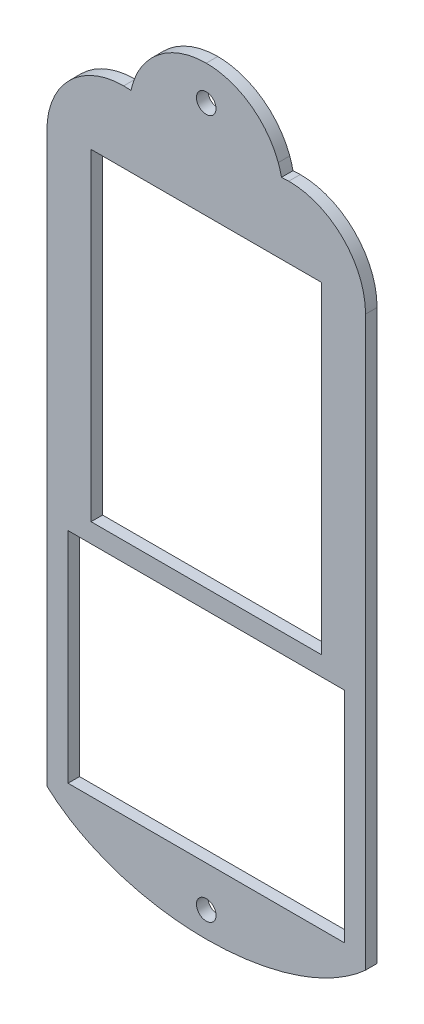
ISO-10303-21;
HEADER;
FILE_DESCRIPTION(('STEP AP214'),'2;1');
FILE_NAME('part.step','',(''),(''),'','','');
FILE_SCHEMA(('AUTOMOTIVE_DESIGN { 1 0 10303 214 1 1 1 1 }'));
ENDSEC;
DATA;
#1=APPLICATION_CONTEXT('core data for automotive mechanical design processes');
#2=APPLICATION_PROTOCOL_DEFINITION('international standard','automotive_design',2000,#1);
#3=PRODUCT_CONTEXT('',#1,'mechanical');
#4=PRODUCT('Part','Part','',(#3));
#5=PRODUCT_RELATED_PRODUCT_CATEGORY('part','',(#4));
#6=PRODUCT_DEFINITION_FORMATION('','',#4);
#7=PRODUCT_DEFINITION_CONTEXT('part definition',#1,'design');
#8=PRODUCT_DEFINITION('design','',#6,#7);
#9=PRODUCT_DEFINITION_SHAPE('','',#8);
#10=(LENGTH_UNIT() NAMED_UNIT(*) SI_UNIT(.MILLI.,.METRE.));
#11=(NAMED_UNIT(*) PLANE_ANGLE_UNIT() SI_UNIT($,.RADIAN.));
#12=(NAMED_UNIT(*) SI_UNIT($,.STERADIAN.) SOLID_ANGLE_UNIT());
#13=UNCERTAINTY_MEASURE_WITH_UNIT(LENGTH_MEASURE(1.E-05),#10,'distance_accuracy_value','');
#14=(GEOMETRIC_REPRESENTATION_CONTEXT(3) GLOBAL_UNCERTAINTY_ASSIGNED_CONTEXT((#13)) GLOBAL_UNIT_ASSIGNED_CONTEXT((#10,
#11,#12)) REPRESENTATION_CONTEXT('',''));
#15=CARTESIAN_POINT('',(0.,0.,0.));
#16=DIRECTION('',(0.,0.,1.));
#17=DIRECTION('',(1.,0.,0.));
#18=AXIS2_PLACEMENT_3D('',#15,#16,#17);
#19=CARTESIAN_POINT('',(-7.6058350285354,82.2924326123432,3.));
#20=DIRECTION('',(0.,0.,-1.));
#21=DIRECTION('',(-1.,0.,0.));
#22=AXIS2_PLACEMENT_3D('',#19,#20,#21);
#23=PLANE('',#22);
#24=DIRECTION('',(0.,-1.,0.));
#25=VECTOR('',#24,1.);
#26=CARTESIAN_POINT('',(-73.2491831836532,69.5718591249572,3.));
#27=LINE('',#26,#25);
#28=CARTESIAN_POINT('',(-73.2491831836532,69.5718591249572,3.));
#29=VERTEX_POINT('',#28);
#30=CARTESIAN_POINT('',(-73.2491831836531,-14.4281408750428,3.));
#31=VERTEX_POINT('',#30);
#32=EDGE_CURVE('E225',#29,#31,#27,.T.);
#33=ORIENTED_EDGE('',*,*,#32,.F.);
#34=DIRECTION('',(-1.,0.,0.));
#35=VECTOR('',#34,1.);
#36=CARTESIAN_POINT('',(-73.2491831836532,69.5718591249572,3.));
#37=LINE('',#36,#35);
#38=CARTESIAN_POINT('',(-13.2491831836531,69.5718591249572,3.));
#39=VERTEX_POINT('',#38);
#40=EDGE_CURVE('E233',#39,#29,#37,.T.);
#41=ORIENTED_EDGE('',*,*,#40,.F.);
#42=DIRECTION('',(0.,1.,0.));
#43=VECTOR('',#42,1.);
#44=CARTESIAN_POINT('',(-13.2491831836531,69.5718591249572,3.));
#45=LINE('',#44,#43);
#46=CARTESIAN_POINT('',(-13.2491831836531,-14.4281408750428,3.));
#47=VERTEX_POINT('',#46);
#48=EDGE_CURVE('E230',#47,#39,#45,.T.);
#49=ORIENTED_EDGE('',*,*,#48,.F.);
#50=DIRECTION('',(1.,0.,0.));
#51=VECTOR('',#50,1.);
#52=CARTESIAN_POINT('',(-73.2491831836531,-14.4281408750428,3.));
#53=LINE('',#52,#51);
#54=EDGE_CURVE('E227',#31,#47,#53,.T.);
#55=ORIENTED_EDGE('',*,*,#54,.F.);
#56=EDGE_LOOP('',(#33,#41,#49,#55));
#57=FACE_BOUND('',#56,.T.);
#58=CARTESIAN_POINT('',(-1.74840024860734,68.1508943137749,3.));
#59=CARTESIAN_POINT('',(-1.74840024860734,79.1963656719619,3.));
#60=CARTESIAN_POINT('',(-10.7019019689167,88.1498673922713,3.));
#61=CARTESIAN_POINT('',(-21.7473733271037,88.1498673922713,3.));
#62=B_SPLINE_CURVE_WITH_KNOTS('',3,(#58,#59,#60,#61),.UNSPECIFIED.,.F.,.F.,(4,4),(0.,1.),.UNSPECIFIED.);
#63=CARTESIAN_POINT('',(-1.74840024860734,68.1508943137749,3.));
#64=VERTEX_POINT('',#63);
#65=CARTESIAN_POINT('',(-21.7473733271037,88.1498673922713,3.));
#66=VERTEX_POINT('',#65);
#67=EDGE_CURVE('E267',#64,#66,#62,.T.);
#68=ORIENTED_EDGE('',*,*,#67,.T.);
#69=CARTESIAN_POINT('',(-21.7473733271037,88.1498673922713,3.));
#70=CARTESIAN_POINT('',(-22.3894314663204,88.1498673922713,3.));
#71=CARTESIAN_POINT('',(-23.0279583826646,88.1181294501134,3.));
#72=CARTESIAN_POINT('',(-23.6559131622385,88.0581417249765,3.));
#73=B_SPLINE_CURVE_WITH_KNOTS('',3,(#69,#70,#71,#72),.UNSPECIFIED.,.F.,.F.,(4,4),(1.,2.),.UNSPECIFIED.);
#74=CARTESIAN_POINT('',(-23.6559131622385,88.0581417249765,3.));
#75=VERTEX_POINT('',#74);
#76=EDGE_CURVE('E273',#66,#75,#73,.T.);
#77=ORIENTED_EDGE('',*,*,#76,.T.);
#78=CARTESIAN_POINT('',(-23.6559131622385,88.0581417249765,3.));
#79=CARTESIAN_POINT('',(-23.8605087703688,89.0565088647551,3.));
#80=CARTESIAN_POINT('',(-24.1427482179979,90.0301789762739,3.));
#81=CARTESIAN_POINT('',(-24.4884635499427,90.9720896137879,3.));
#82=B_SPLINE_CURVE_WITH_KNOTS('',3,(#78,#79,#80,#81),.UNSPECIFIED.,.F.,.F.,(4,4),(2.,3.),.UNSPECIFIED.);
#83=CARTESIAN_POINT('',(-24.4884635499427,90.9720896137879,3.));
#84=VERTEX_POINT('',#83);
#85=EDGE_CURVE('E282',#75,#84,#82,.T.);
#86=ORIENTED_EDGE('',*,*,#85,.T.);
#87=CARTESIAN_POINT('',(-24.4884635499427,90.9720896137879,3.));
#88=CARTESIAN_POINT('',(-27.3106857714594,98.592102530991,3.));
#89=CARTESIAN_POINT('',(-34.644928018161,104.024867388303,3.));
#90=CARTESIAN_POINT('',(-43.2491831836531,104.024867388303,3.));
#91=B_SPLINE_CURVE_WITH_KNOTS('',3,(#87,#88,#89,#90),.UNSPECIFIED.,.F.,.F.,(4,4),(3.,4.),.UNSPECIFIED.);
#92=CARTESIAN_POINT('',(-43.2491831836531,104.024867388303,3.));
#93=VERTEX_POINT('',#92);
#94=EDGE_CURVE('E305',#84,#93,#91,.T.);
#95=ORIENTED_EDGE('',*,*,#94,.T.);
#96=CARTESIAN_POINT('',(-43.2491831836531,104.024867388303,3.));
#97=CARTESIAN_POINT('',(-51.8534383491453,104.024867388303,3.));
#98=CARTESIAN_POINT('',(-59.1876805958469,98.592102530991,3.));
#99=CARTESIAN_POINT('',(-62.0099028173636,90.9720896137879,3.));
#100=B_SPLINE_CURVE_WITH_KNOTS('',3,(#96,#97,#98,#99),.UNSPECIFIED.,.F.,.F.,(4,4),(4.,5.),.UNSPECIFIED.);
#101=CARTESIAN_POINT('',(-62.0099028173636,90.9720896137879,3.));
#102=VERTEX_POINT('',#101);
#103=EDGE_CURVE('E309',#93,#102,#100,.T.);
#104=ORIENTED_EDGE('',*,*,#103,.T.);
#105=CARTESIAN_POINT('',(-62.0099028173636,90.9720896137879,3.));
#106=CARTESIAN_POINT('',(-62.3556396811552,90.0301789762739,3.));
#107=CARTESIAN_POINT('',(-62.6378575969375,89.0565088647551,3.));
#108=CARTESIAN_POINT('',(-62.8424532050678,88.0581417249765,3.));
#109=B_SPLINE_CURVE_WITH_KNOTS('',3,(#105,#106,#107,#108),.UNSPECIFIED.,.F.,.F.,(4,4),(5.,6.),.UNSPECIFIED.);
#110=CARTESIAN_POINT('',(-62.8424532050678,88.0581417249765,3.));
#111=VERTEX_POINT('',#110);
#112=EDGE_CURVE('E317',#102,#111,#109,.T.);
#113=ORIENTED_EDGE('',*,*,#112,.T.);
#114=CARTESIAN_POINT('',(-62.8424532050678,88.0581417249765,3.));
#115=CARTESIAN_POINT('',(-63.4704079846417,88.1181294501134,3.));
#116=CARTESIAN_POINT('',(-64.1054036781136,88.1498673922713,3.));
#117=CARTESIAN_POINT('',(-64.7474618173302,88.1498673922713,3.));
#118=B_SPLINE_CURVE_WITH_KNOTS('',3,(#114,#115,#116,#117),.UNSPECIFIED.,.F.,.F.,(4,4),(6.,7.),.UNSPECIFIED.);
#119=CARTESIAN_POINT('',(-64.7474618173302,88.1498673922713,3.));
#120=VERTEX_POINT('',#119);
#121=EDGE_CURVE('E325',#111,#120,#118,.T.);
#122=ORIENTED_EDGE('',*,*,#121,.T.);
#123=CARTESIAN_POINT('',(-64.7474618173302,88.1498673922713,3.));
#124=CARTESIAN_POINT('',(-75.7964643983896,88.1498673922713,3.));
#125=CARTESIAN_POINT('',(-84.749966118699,79.1963656719619,3.));
#126=CARTESIAN_POINT('',(-84.749966118699,68.1508943137749,3.));
#127=B_SPLINE_CURVE_WITH_KNOTS('',3,(#123,#124,#125,#126),.UNSPECIFIED.,.F.,.F.,(4,4),(7.,8.),.UNSPECIFIED.);
#128=CARTESIAN_POINT('',(-84.749966118699,68.1508943137749,3.));
#129=VERTEX_POINT('',#128);
#130=EDGE_CURVE('E347',#120,#129,#127,.T.);
#131=ORIENTED_EDGE('',*,*,#130,.T.);
#132=DIRECTION('',(0.,-1.,0.));
#133=VECTOR('',#132,1.);
#134=CARTESIAN_POINT('',(-84.749966118699,68.1508943137749,3.));
#135=LINE('',#134,#133);
#136=CARTESIAN_POINT('',(-84.7499661186989,-79.8491056862251,3.));
#137=VERTEX_POINT('',#136);
#138=EDGE_CURVE('E352',#129,#137,#135,.T.);
#139=ORIENTED_EDGE('',*,*,#138,.T.);
#140=CARTESIAN_POINT('',(-84.7499661186989,-79.8491056862251,3.));
#141=CARTESIAN_POINT('',(-81.6384635356552,-82.6924937131293,3.));
#142=CARTESIAN_POINT('',(-77.8178741743599,-85.1972288538334,3.));
#143=CARTESIAN_POINT('',(-73.4469523411428,-87.2680326863235,3.));
#144=B_SPLINE_CURVE_WITH_KNOTS('',3,(#140,#141,#142,#143),.UNSPECIFIED.,.F.,.F.,(4,4),(11.,12.),.UNSPECIFIED.);
#145=CARTESIAN_POINT('',(-73.4469523411428,-87.2680326863235,3.));
#146=VERTEX_POINT('',#145);
#147=EDGE_CURVE('E357',#137,#146,#144,.T.);
#148=ORIENTED_EDGE('',*,*,#147,.T.);
#149=CARTESIAN_POINT('',(-73.4469523411428,-87.2680326863235,3.));
#150=CARTESIAN_POINT('',(-65.0296797331125,-91.2579484907188,3.));
#151=CARTESIAN_POINT('',(-54.5733412347501,-93.618032684736,3.));
#152=CARTESIAN_POINT('',(-43.2491831836531,-93.618032684736,3.));
#153=B_SPLINE_CURVE_WITH_KNOTS('',3,(#149,#150,#151,#152),.UNSPECIFIED.,.F.,.F.,(4,4),(12.,13.),.UNSPECIFIED.);
#154=CARTESIAN_POINT('',(-43.2491831836531,-93.618032684736,3.));
#155=VERTEX_POINT('',#154);
#156=EDGE_CURVE('E362',#146,#155,#153,.T.);
#157=ORIENTED_EDGE('',*,*,#156,.T.);
#158=CARTESIAN_POINT('',(-43.2491831836531,-93.618032684736,3.));
#159=CARTESIAN_POINT('',(-31.9250251325562,-93.618032684736,3.));
#160=CARTESIAN_POINT('',(-21.4686866341937,-91.2579484907188,3.));
#161=CARTESIAN_POINT('',(-13.0514140261635,-87.2680326863235,3.));
#162=B_SPLINE_CURVE_WITH_KNOTS('',3,(#158,#159,#160,#161),.UNSPECIFIED.,.F.,.F.,(4,4),(13.,14.),.UNSPECIFIED.);
#163=CARTESIAN_POINT('',(-13.0514140261635,-87.2680326863235,3.));
#164=VERTEX_POINT('',#163);
#165=EDGE_CURVE('E385',#155,#164,#162,.T.);
#166=ORIENTED_EDGE('',*,*,#165,.T.);
#167=CARTESIAN_POINT('',(-13.0514140261635,-87.2680326863235,3.));
#168=CARTESIAN_POINT('',(-8.68049219294634,-85.1972288538334,3.));
#169=CARTESIAN_POINT('',(-4.85990283165106,-82.6924937131293,3.));
#170=CARTESIAN_POINT('',(-1.74840024860732,-79.8491056862251,3.));
#171=B_SPLINE_CURVE_WITH_KNOTS('',3,(#167,#168,#169,#170),.UNSPECIFIED.,.F.,.F.,(4,4),(14.,15.),.UNSPECIFIED.);
#172=CARTESIAN_POINT('',(-1.74840024860732,-79.8491056862251,3.));
#173=VERTEX_POINT('',#172);
#174=EDGE_CURVE('E389',#164,#173,#171,.T.);
#175=ORIENTED_EDGE('',*,*,#174,.T.);
#176=DIRECTION('',(0.,1.,0.));
#177=VECTOR('',#176,1.);
#178=CARTESIAN_POINT('',(-1.74840024860734,68.1508943137749,3.));
#179=LINE('',#178,#177);
#180=EDGE_CURVE('E397',#173,#64,#179,.T.);
#181=ORIENTED_EDGE('',*,*,#180,.T.);
#182=EDGE_LOOP('',(#68,#77,#86,#95,#104,#113,#122,#131,#139,#148,#157,#166,#175,#181));
#183=FACE_BOUND('',#182,.T.);
#184=CARTESIAN_POINT('',(-43.2491831836531,95.0101030947806,3.));
#185=DIRECTION('',(0.,0.,1.));
#186=DIRECTION('',(1.,0.,0.));
#187=AXIS2_PLACEMENT_3D('',#184,#185,#186);
#188=CIRCLE('',#187,2.55);
#189=CARTESIAN_POINT('',(-40.6991831836531,95.0101030947806,3.));
#190=VERTEX_POINT('',#189);
#191=EDGE_CURVE('E262',#190,#190,#188,.T.);
#192=ORIENTED_EDGE('',*,*,#191,.F.);
#193=EDGE_LOOP('',(#192));
#194=FACE_BOUND('',#193,.T.);
#195=CARTESIAN_POINT('',(-43.2491831836531,-86.9898969052195,3.));
#196=DIRECTION('',(0.,0.,1.));
#197=DIRECTION('',(1.,0.,0.));
#198=AXIS2_PLACEMENT_3D('',#195,#196,#197);
#199=CIRCLE('',#198,2.54999999999999);
#200=CARTESIAN_POINT('',(-40.6991831836532,-86.9898969052195,3.));
#201=VERTEX_POINT('',#200);
#202=EDGE_CURVE('E256',#201,#201,#199,.T.);
#203=ORIENTED_EDGE('',*,*,#202,.F.);
#204=EDGE_LOOP('',(#203));
#205=FACE_BOUND('',#204,.T.);
#206=DIRECTION('',(0.,-1.,0.));
#207=VECTOR('',#206,1.);
#208=CARTESIAN_POINT('',(-79.2491831836531,-19.4281408750428,3.));
#209=LINE('',#208,#207);
#210=CARTESIAN_POINT('',(-79.2491831836531,-19.4281408750428,3.));
#211=VERTEX_POINT('',#210);
#212=CARTESIAN_POINT('',(-79.2491831836531,-76.4281408750428,3.));
#213=VERTEX_POINT('',#212);
#214=EDGE_CURVE('E189',#211,#213,#209,.T.);
#215=ORIENTED_EDGE('',*,*,#214,.F.);
#216=DIRECTION('',(-1.,0.,0.));
#217=VECTOR('',#216,1.);
#218=CARTESIAN_POINT('',(-79.2491831836531,-19.4281408750428,3.));
#219=LINE('',#218,#217);
#220=CARTESIAN_POINT('',(-7.24918318365313,-19.4281408750428,3.));
#221=VERTEX_POINT('',#220);
#222=EDGE_CURVE('E211',#221,#211,#219,.T.);
#223=ORIENTED_EDGE('',*,*,#222,.F.);
#224=DIRECTION('',(0.,1.,0.));
#225=VECTOR('',#224,1.);
#226=CARTESIAN_POINT('',(-7.24918318365313,-19.4281408750428,3.));
#227=LINE('',#226,#225);
#228=CARTESIAN_POINT('',(-7.24918318365311,-76.4281408750428,3.));
#229=VERTEX_POINT('',#228);
#230=EDGE_CURVE('E209',#229,#221,#227,.T.);
#231=ORIENTED_EDGE('',*,*,#230,.F.);
#232=DIRECTION('',(1.,0.,0.));
#233=VECTOR('',#232,1.);
#234=CARTESIAN_POINT('',(-79.2491831836531,-76.4281408750428,3.));
#235=LINE('',#234,#233);
#236=EDGE_CURVE('E197',#213,#229,#235,.T.);
#237=ORIENTED_EDGE('',*,*,#236,.F.);
#238=EDGE_LOOP('',(#215,#223,#231,#237));
#239=FACE_BOUND('',#238,.T.);
#240=ADVANCED_FACE('F39',(#57,#183,#194,#205,#239),#23,.F.);
#241=CARTESIAN_POINT('',(-7.6058350285354,82.2924326123432,0.));
#242=DIRECTION('',(0.,0.,-1.));
#243=DIRECTION('',(-1.,0.,0.));
#244=AXIS2_PLACEMENT_3D('',#241,#242,#243);
#245=PLANE('',#244);
#246=CARTESIAN_POINT('',(-43.2491831836531,95.0101030947806,0.));
#247=DIRECTION('',(0.,0.,1.));
#248=DIRECTION('',(1.,0.,0.));
#249=AXIS2_PLACEMENT_3D('',#246,#247,#248);
#250=CIRCLE('',#249,2.55);
#251=CARTESIAN_POINT('',(-40.6991831836531,95.0101030947806,0.));
#252=VERTEX_POINT('',#251);
#253=EDGE_CURVE('E259',#252,#252,#250,.T.);
#254=ORIENTED_EDGE('',*,*,#253,.T.);
#255=EDGE_LOOP('',(#254));
#256=FACE_BOUND('',#255,.T.);
#257=CARTESIAN_POINT('',(-1.74840024860734,68.1508943137749,0.));
#258=CARTESIAN_POINT('',(-1.74840024860734,79.1963656719619,0.));
#259=CARTESIAN_POINT('',(-10.7019019689167,88.1498673922713,0.));
#260=CARTESIAN_POINT('',(-21.7473733271037,88.1498673922713,0.));
#261=B_SPLINE_CURVE_WITH_KNOTS('',3,(#257,#258,#259,#260),.UNSPECIFIED.,.F.,.F.,(4,4),(0.,1.),.UNSPECIFIED.);
#262=CARTESIAN_POINT('',(-1.74840024860734,68.1508943137749,0.));
#263=VERTEX_POINT('',#262);
#264=CARTESIAN_POINT('',(-21.7473733271037,88.1498673922713,0.));
#265=VERTEX_POINT('',#264);
#266=EDGE_CURVE('E265',#263,#265,#261,.T.);
#267=ORIENTED_EDGE('',*,*,#266,.F.);
#268=DIRECTION('',(0.,1.,0.));
#269=VECTOR('',#268,1.);
#270=CARTESIAN_POINT('',(-1.74840024860734,68.1508943137749,0.));
#271=LINE('',#270,#269);
#272=CARTESIAN_POINT('',(-1.74840024860732,-79.8491056862251,0.));
#273=VERTEX_POINT('',#272);
#274=EDGE_CURVE('E274',#273,#263,#271,.T.);
#275=ORIENTED_EDGE('',*,*,#274,.F.);
#276=CARTESIAN_POINT('',(-13.0514140261635,-87.2680326863235,0.));
#277=CARTESIAN_POINT('',(-8.68049219294634,-85.1972288538334,0.));
#278=CARTESIAN_POINT('',(-4.85990283165106,-82.6924937131293,0.));
#279=CARTESIAN_POINT('',(-1.74840024860732,-79.8491056862251,0.));
#280=B_SPLINE_CURVE_WITH_KNOTS('',3,(#276,#277,#278,#279),.UNSPECIFIED.,.F.,.F.,(4,4),(14.,15.),.UNSPECIFIED.);
#281=CARTESIAN_POINT('',(-13.0514140261635,-87.2680326863235,0.));
#282=VERTEX_POINT('',#281);
#283=EDGE_CURVE('E479',#282,#273,#280,.T.);
#284=ORIENTED_EDGE('',*,*,#283,.F.);
#285=CARTESIAN_POINT('',(-43.2491831836531,-93.618032684736,0.));
#286=CARTESIAN_POINT('',(-31.9250251325562,-93.618032684736,0.));
#287=CARTESIAN_POINT('',(-21.4686866341937,-91.2579484907188,0.));
#288=CARTESIAN_POINT('',(-13.0514140261635,-87.2680326863235,0.));
#289=B_SPLINE_CURVE_WITH_KNOTS('',3,(#285,#286,#287,#288),.UNSPECIFIED.,.F.,.F.,(4,4),(13.,14.),.UNSPECIFIED.);
#290=CARTESIAN_POINT('',(-43.2491831836531,-93.618032684736,0.));
#291=VERTEX_POINT('',#290);
#292=EDGE_CURVE('E472',#291,#282,#289,.T.);
#293=ORIENTED_EDGE('',*,*,#292,.F.);
#294=CARTESIAN_POINT('',(-73.4469523411428,-87.2680326863235,0.));
#295=CARTESIAN_POINT('',(-65.0296797331125,-91.2579484907188,0.));
#296=CARTESIAN_POINT('',(-54.5733412347501,-93.618032684736,0.));
#297=CARTESIAN_POINT('',(-43.2491831836531,-93.618032684736,0.));
#298=B_SPLINE_CURVE_WITH_KNOTS('',3,(#294,#295,#296,#297),.UNSPECIFIED.,.F.,.F.,(4,4),(12.,13.),.UNSPECIFIED.);
#299=CARTESIAN_POINT('',(-73.4469523411428,-87.2680326863235,0.));
#300=VERTEX_POINT('',#299);
#301=EDGE_CURVE('E465',#300,#291,#298,.T.);
#302=ORIENTED_EDGE('',*,*,#301,.F.);
#303=CARTESIAN_POINT('',(-84.7499661186989,-79.8491056862251,0.));
#304=CARTESIAN_POINT('',(-81.6384635356552,-82.6924937131293,0.));
#305=CARTESIAN_POINT('',(-77.8178741743599,-85.1972288538334,0.));
#306=CARTESIAN_POINT('',(-73.4469523411428,-87.2680326863235,0.));
#307=B_SPLINE_CURVE_WITH_KNOTS('',3,(#303,#304,#305,#306),.UNSPECIFIED.,.F.,.F.,(4,4),(11.,12.),.UNSPECIFIED.);
#308=CARTESIAN_POINT('',(-84.7499661186989,-79.8491056862251,0.));
#309=VERTEX_POINT('',#308);
#310=EDGE_CURVE('E461',#309,#300,#307,.T.);
#311=ORIENTED_EDGE('',*,*,#310,.F.);
#312=DIRECTION('',(0.,-1.,0.));
#313=VECTOR('',#312,1.);
#314=CARTESIAN_POINT('',(-84.749966118699,68.1508943137749,0.));
#315=LINE('',#314,#313);
#316=CARTESIAN_POINT('',(-84.749966118699,68.1508943137749,0.));
#317=VERTEX_POINT('',#316);
#318=EDGE_CURVE('E456',#317,#309,#315,.T.);
#319=ORIENTED_EDGE('',*,*,#318,.F.);
#320=CARTESIAN_POINT('',(-64.7474618173302,88.1498673922713,0.));
#321=CARTESIAN_POINT('',(-75.7964643983896,88.1498673922713,0.));
#322=CARTESIAN_POINT('',(-84.749966118699,79.1963656719619,0.));
#323=CARTESIAN_POINT('',(-84.749966118699,68.1508943137749,0.));
#324=B_SPLINE_CURVE_WITH_KNOTS('',3,(#320,#321,#322,#323),.UNSPECIFIED.,.F.,.F.,(4,4),(7.,8.),.UNSPECIFIED.);
#325=CARTESIAN_POINT('',(-64.7474618173302,88.1498673922713,0.));
#326=VERTEX_POINT('',#325);
#327=EDGE_CURVE('E449',#326,#317,#324,.T.);
#328=ORIENTED_EDGE('',*,*,#327,.F.);
#329=CARTESIAN_POINT('',(-62.8424532050678,88.0581417249765,0.));
#330=CARTESIAN_POINT('',(-63.4704079846417,88.1181294501134,0.));
#331=CARTESIAN_POINT('',(-64.1054036781136,88.1498673922713,0.));
#332=CARTESIAN_POINT('',(-64.7474618173302,88.1498673922713,0.));
#333=B_SPLINE_CURVE_WITH_KNOTS('',3,(#329,#330,#331,#332),.UNSPECIFIED.,.F.,.F.,(4,4),(6.,7.),.UNSPECIFIED.);
#334=CARTESIAN_POINT('',(-62.8424532050678,88.0581417249765,0.));
#335=VERTEX_POINT('',#334);
#336=EDGE_CURVE('E442',#335,#326,#333,.T.);
#337=ORIENTED_EDGE('',*,*,#336,.F.);
#338=CARTESIAN_POINT('',(-62.0099028173636,90.9720896137879,0.));
#339=CARTESIAN_POINT('',(-62.3556396811552,90.0301789762739,0.));
#340=CARTESIAN_POINT('',(-62.6378575969375,89.0565088647551,0.));
#341=CARTESIAN_POINT('',(-62.8424532050678,88.0581417249765,0.));
#342=B_SPLINE_CURVE_WITH_KNOTS('',3,(#338,#339,#340,#341),.UNSPECIFIED.,.F.,.F.,(4,4),(5.,6.),.UNSPECIFIED.);
#343=CARTESIAN_POINT('',(-62.0099028173636,90.9720896137879,0.));
#344=VERTEX_POINT('',#343);
#345=EDGE_CURVE('E435',#344,#335,#342,.T.);
#346=ORIENTED_EDGE('',*,*,#345,.F.);
#347=CARTESIAN_POINT('',(-43.2491831836531,104.024867388303,0.));
#348=CARTESIAN_POINT('',(-51.8534383491453,104.024867388303,0.));
#349=CARTESIAN_POINT('',(-59.1876805958469,98.592102530991,0.));
#350=CARTESIAN_POINT('',(-62.0099028173636,90.9720896137879,0.));
#351=B_SPLINE_CURVE_WITH_KNOTS('',3,(#347,#348,#349,#350),.UNSPECIFIED.,.F.,.F.,(4,4),(4.,5.),.UNSPECIFIED.);
#352=CARTESIAN_POINT('',(-43.2491831836531,104.024867388303,0.));
#353=VERTEX_POINT('',#352);
#354=EDGE_CURVE('E428',#353,#344,#351,.T.);
#355=ORIENTED_EDGE('',*,*,#354,.F.);
#356=CARTESIAN_POINT('',(-24.4884635499427,90.9720896137879,0.));
#357=CARTESIAN_POINT('',(-27.3106857714594,98.592102530991,0.));
#358=CARTESIAN_POINT('',(-34.644928018161,104.024867388303,0.));
#359=CARTESIAN_POINT('',(-43.2491831836531,104.024867388303,0.));
#360=B_SPLINE_CURVE_WITH_KNOTS('',3,(#356,#357,#358,#359),.UNSPECIFIED.,.F.,.F.,(4,4),(3.,4.),.UNSPECIFIED.);
#361=CARTESIAN_POINT('',(-24.4884635499427,90.9720896137879,0.));
#362=VERTEX_POINT('',#361);
#363=EDGE_CURVE('E421',#362,#353,#360,.T.);
#364=ORIENTED_EDGE('',*,*,#363,.F.);
#365=CARTESIAN_POINT('',(-23.6559131622385,88.0581417249765,0.));
#366=CARTESIAN_POINT('',(-23.8605087703688,89.0565088647551,0.));
#367=CARTESIAN_POINT('',(-24.1427482179979,90.0301789762739,0.));
#368=CARTESIAN_POINT('',(-24.4884635499427,90.9720896137879,0.));
#369=B_SPLINE_CURVE_WITH_KNOTS('',3,(#365,#366,#367,#368),.UNSPECIFIED.,.F.,.F.,(4,4),(2.,3.),.UNSPECIFIED.);
#370=CARTESIAN_POINT('',(-23.6559131622385,88.0581417249765,0.));
#371=VERTEX_POINT('',#370);
#372=EDGE_CURVE('E414',#371,#362,#369,.T.);
#373=ORIENTED_EDGE('',*,*,#372,.F.);
#374=CARTESIAN_POINT('',(-21.7473733271037,88.1498673922713,0.));
#375=CARTESIAN_POINT('',(-22.3894314663204,88.1498673922713,0.));
#376=CARTESIAN_POINT('',(-23.0279583826646,88.1181294501134,0.));
#377=CARTESIAN_POINT('',(-23.6559131622385,88.0581417249765,0.));
#378=B_SPLINE_CURVE_WITH_KNOTS('',3,(#374,#375,#376,#377),.UNSPECIFIED.,.F.,.F.,(4,4),(1.,2.),.UNSPECIFIED.);
#379=EDGE_CURVE('E407',#265,#371,#378,.T.);
#380=ORIENTED_EDGE('',*,*,#379,.F.);
#381=EDGE_LOOP('',(#267,#275,#284,#293,#302,#311,#319,#328,#337,#346,#355,#364,#373,#380));
#382=FACE_BOUND('',#381,.T.);
#383=CARTESIAN_POINT('',(-43.2491831836531,-86.9898969052195,0.));
#384=DIRECTION('',(0.,0.,1.));
#385=DIRECTION('',(1.,0.,0.));
#386=AXIS2_PLACEMENT_3D('',#383,#384,#385);
#387=CIRCLE('',#386,2.54999999999999);
#388=CARTESIAN_POINT('',(-40.6991831836532,-86.9898969052195,0.));
#389=VERTEX_POINT('',#388);
#390=EDGE_CURVE('E255',#389,#389,#387,.T.);
#391=ORIENTED_EDGE('',*,*,#390,.T.);
#392=EDGE_LOOP('',(#391));
#393=FACE_BOUND('',#392,.T.);
#394=DIRECTION('',(-1.,0.,0.));
#395=VECTOR('',#394,1.);
#396=CARTESIAN_POINT('',(-73.2491831836532,69.5718591249572,0.));
#397=LINE('',#396,#395);
#398=CARTESIAN_POINT('',(-13.2491831836531,69.5718591249572,0.));
#399=VERTEX_POINT('',#398);
#400=CARTESIAN_POINT('',(-73.2491831836532,69.5718591249572,0.));
#401=VERTEX_POINT('',#400);
#402=EDGE_CURVE('E228',#399,#401,#397,.T.);
#403=ORIENTED_EDGE('',*,*,#402,.T.);
#404=DIRECTION('',(0.,-1.,0.));
#405=VECTOR('',#404,1.);
#406=CARTESIAN_POINT('',(-73.2491831836532,69.5718591249572,0.));
#407=LINE('',#406,#405);
#408=CARTESIAN_POINT('',(-73.2491831836531,-14.4281408750428,0.));
#409=VERTEX_POINT('',#408);
#410=EDGE_CURVE('E205',#401,#409,#407,.T.);
#411=ORIENTED_EDGE('',*,*,#410,.T.);
#412=DIRECTION('',(1.,0.,0.));
#413=VECTOR('',#412,1.);
#414=CARTESIAN_POINT('',(-73.2491831836531,-14.4281408750428,0.));
#415=LINE('',#414,#413);
#416=CARTESIAN_POINT('',(-13.2491831836531,-14.4281408750428,0.));
#417=VERTEX_POINT('',#416);
#418=EDGE_CURVE('E238',#409,#417,#415,.T.);
#419=ORIENTED_EDGE('',*,*,#418,.T.);
#420=DIRECTION('',(0.,1.,0.));
#421=VECTOR('',#420,1.);
#422=CARTESIAN_POINT('',(-13.2491831836531,69.5718591249572,0.));
#423=LINE('',#422,#421);
#424=EDGE_CURVE('E241',#417,#399,#423,.T.);
#425=ORIENTED_EDGE('',*,*,#424,.T.);
#426=EDGE_LOOP('',(#403,#411,#419,#425));
#427=FACE_BOUND('',#426,.T.);
#428=DIRECTION('',(-1.,0.,0.));
#429=VECTOR('',#428,1.);
#430=CARTESIAN_POINT('',(-79.2491831836531,-19.4281408750428,0.));
#431=LINE('',#430,#429);
#432=CARTESIAN_POINT('',(-7.24918318365313,-19.4281408750428,0.));
#433=VERTEX_POINT('',#432);
#434=CARTESIAN_POINT('',(-79.2491831836531,-19.4281408750428,0.));
#435=VERTEX_POINT('',#434);
#436=EDGE_CURVE('E198',#433,#435,#431,.T.);
#437=ORIENTED_EDGE('',*,*,#436,.T.);
#438=DIRECTION('',(0.,-1.,0.));
#439=VECTOR('',#438,1.);
#440=CARTESIAN_POINT('',(-79.2491831836531,-19.4281408750428,0.));
#441=LINE('',#440,#439);
#442=CARTESIAN_POINT('',(-79.2491831836531,-76.4281408750428,0.));
#443=VERTEX_POINT('',#442);
#444=EDGE_CURVE('E63',#435,#443,#441,.T.);
#445=ORIENTED_EDGE('',*,*,#444,.T.);
#446=DIRECTION('',(1.,0.,0.));
#447=VECTOR('',#446,1.);
#448=CARTESIAN_POINT('',(-79.2491831836531,-76.4281408750428,0.));
#449=LINE('',#448,#447);
#450=CARTESIAN_POINT('',(-7.24918318365311,-76.4281408750428,0.));
#451=VERTEX_POINT('',#450);
#452=EDGE_CURVE('E204',#443,#451,#449,.T.);
#453=ORIENTED_EDGE('',*,*,#452,.T.);
#454=DIRECTION('',(0.,1.,0.));
#455=VECTOR('',#454,1.);
#456=CARTESIAN_POINT('',(-7.24918318365313,-19.4281408750428,0.));
#457=LINE('',#456,#455);
#458=EDGE_CURVE('E217',#451,#433,#457,.T.);
#459=ORIENTED_EDGE('',*,*,#458,.T.);
#460=EDGE_LOOP('',(#437,#445,#453,#459));
#461=FACE_BOUND('',#460,.T.);
#462=ADVANCED_FACE('F532',(#256,#382,#393,#427,#461),#245,.T.);
#463=DIRECTION('',(0.,0.,-1.));
#464=VECTOR('',#463,1.);
#465=SURFACE_OF_LINEAR_EXTRUSION('',#62,#464);
#466=ORIENTED_EDGE('',*,*,#266,.T.);
#467=DIRECTION('',(0.,0.,-1.));
#468=VECTOR('',#467,1.);
#469=CARTESIAN_POINT('',(-21.7473733271037,88.1498673922713,3.));
#470=LINE('',#469,#468);
#471=EDGE_CURVE('E11',#66,#265,#470,.T.);
#472=ORIENTED_EDGE('',*,*,#471,.F.);
#473=ORIENTED_EDGE('',*,*,#67,.F.);
#474=DIRECTION('',(0.,0.,-1.));
#475=VECTOR('',#474,1.);
#476=CARTESIAN_POINT('',(-1.74840024860734,68.1508943137749,3.));
#477=LINE('',#476,#475);
#478=EDGE_CURVE('E402',#64,#263,#477,.T.);
#479=ORIENTED_EDGE('',*,*,#478,.T.);
#480=EDGE_LOOP('',(#466,#472,#473,#479));
#481=FACE_BOUND('',#480,.T.);
#482=ADVANCED_FACE('F41',(#481),#465,.F.);
#483=DIRECTION('',(0.,0.,-1.));
#484=VECTOR('',#483,1.);
#485=SURFACE_OF_LINEAR_EXTRUSION('',#73,#484);
#486=ORIENTED_EDGE('',*,*,#379,.T.);
#487=DIRECTION('',(0.,0.,-1.));
#488=VECTOR('',#487,1.);
#489=CARTESIAN_POINT('',(-23.6559131622385,88.0581417249765,3.));
#490=LINE('',#489,#488);
#491=EDGE_CURVE('E48',#75,#371,#490,.T.);
#492=ORIENTED_EDGE('',*,*,#491,.F.);
#493=ORIENTED_EDGE('',*,*,#76,.F.);
#494=ORIENTED_EDGE('',*,*,#471,.T.);
#495=EDGE_LOOP('',(#486,#492,#493,#494));
#496=FACE_BOUND('',#495,.T.);
#497=ADVANCED_FACE('F290',(#496),#485,.F.);
#498=DIRECTION('',(0.,0.,-1.));
#499=VECTOR('',#498,1.);
#500=SURFACE_OF_LINEAR_EXTRUSION('',#82,#499);
#501=ORIENTED_EDGE('',*,*,#372,.T.);
#502=DIRECTION('',(0.,0.,-1.));
#503=VECTOR('',#502,1.);
#504=CARTESIAN_POINT('',(-24.4884635499427,90.9720896137879,3.));
#505=LINE('',#504,#503);
#506=EDGE_CURVE('E522',#84,#362,#505,.T.);
#507=ORIENTED_EDGE('',*,*,#506,.F.);
#508=ORIENTED_EDGE('',*,*,#85,.F.);
#509=ORIENTED_EDGE('',*,*,#491,.T.);
#510=EDGE_LOOP('',(#501,#507,#508,#509));
#511=FACE_BOUND('',#510,.T.);
#512=ADVANCED_FACE('F293',(#511),#500,.F.);
#513=DIRECTION('',(0.,0.,-1.));
#514=VECTOR('',#513,1.);
#515=SURFACE_OF_LINEAR_EXTRUSION('',#91,#514);
#516=ORIENTED_EDGE('',*,*,#363,.T.);
#517=DIRECTION('',(0.,0.,-1.));
#518=VECTOR('',#517,1.);
#519=CARTESIAN_POINT('',(-43.2491831836531,104.024867388303,3.));
#520=LINE('',#519,#518);
#521=EDGE_CURVE('E519',#93,#353,#520,.T.);
#522=ORIENTED_EDGE('',*,*,#521,.F.);
#523=ORIENTED_EDGE('',*,*,#94,.F.);
#524=ORIENTED_EDGE('',*,*,#506,.T.);
#525=EDGE_LOOP('',(#516,#522,#523,#524));
#526=FACE_BOUND('',#525,.T.);
#527=ADVANCED_FACE('F297',(#526),#515,.F.);
#528=DIRECTION('',(0.,0.,-1.));
#529=VECTOR('',#528,1.);
#530=SURFACE_OF_LINEAR_EXTRUSION('',#100,#529);
#531=ORIENTED_EDGE('',*,*,#354,.T.);
#532=DIRECTION('',(0.,0.,-1.));
#533=VECTOR('',#532,1.);
#534=CARTESIAN_POINT('',(-62.0099028173636,90.9720896137879,3.));
#535=LINE('',#534,#533);
#536=EDGE_CURVE('E516',#102,#344,#535,.T.);
#537=ORIENTED_EDGE('',*,*,#536,.F.);
#538=ORIENTED_EDGE('',*,*,#103,.F.);
#539=ORIENTED_EDGE('',*,*,#521,.T.);
#540=EDGE_LOOP('',(#531,#537,#538,#539));
#541=FACE_BOUND('',#540,.T.);
#542=ADVANCED_FACE('F301',(#541),#530,.F.);
#543=DIRECTION('',(0.,0.,-1.));
#544=VECTOR('',#543,1.);
#545=SURFACE_OF_LINEAR_EXTRUSION('',#109,#544);
#546=ORIENTED_EDGE('',*,*,#345,.T.);
#547=DIRECTION('',(0.,0.,-1.));
#548=VECTOR('',#547,1.);
#549=CARTESIAN_POINT('',(-62.8424532050678,88.0581417249765,3.));
#550=LINE('',#549,#548);
#551=EDGE_CURVE('E513',#111,#335,#550,.T.);
#552=ORIENTED_EDGE('',*,*,#551,.F.);
#553=ORIENTED_EDGE('',*,*,#112,.F.);
#554=ORIENTED_EDGE('',*,*,#536,.T.);
#555=EDGE_LOOP('',(#546,#552,#553,#554));
#556=FACE_BOUND('',#555,.T.);
#557=ADVANCED_FACE('F333',(#556),#545,.F.);
#558=DIRECTION('',(0.,0.,-1.));
#559=VECTOR('',#558,1.);
#560=SURFACE_OF_LINEAR_EXTRUSION('',#118,#559);
#561=ORIENTED_EDGE('',*,*,#336,.T.);
#562=DIRECTION('',(0.,0.,-1.));
#563=VECTOR('',#562,1.);
#564=CARTESIAN_POINT('',(-64.7474618173302,88.1498673922713,3.));
#565=LINE('',#564,#563);
#566=EDGE_CURVE('E510',#120,#326,#565,.T.);
#567=ORIENTED_EDGE('',*,*,#566,.F.);
#568=ORIENTED_EDGE('',*,*,#121,.F.);
#569=ORIENTED_EDGE('',*,*,#551,.T.);
#570=EDGE_LOOP('',(#561,#567,#568,#569));
#571=FACE_BOUND('',#570,.T.);
#572=ADVANCED_FACE('F336',(#571),#560,.F.);
#573=DIRECTION('',(0.,0.,-1.));
#574=VECTOR('',#573,1.);
#575=SURFACE_OF_LINEAR_EXTRUSION('',#127,#574);
#576=ORIENTED_EDGE('',*,*,#327,.T.);
#577=DIRECTION('',(0.,0.,-1.));
#578=VECTOR('',#577,1.);
#579=CARTESIAN_POINT('',(-84.749966118699,68.1508943137749,3.));
#580=LINE('',#579,#578);
#581=EDGE_CURVE('E507',#129,#317,#580,.T.);
#582=ORIENTED_EDGE('',*,*,#581,.F.);
#583=ORIENTED_EDGE('',*,*,#130,.F.);
#584=ORIENTED_EDGE('',*,*,#566,.T.);
#585=EDGE_LOOP('',(#576,#582,#583,#584));
#586=FACE_BOUND('',#585,.T.);
#587=ADVANCED_FACE('F340',(#586),#575,.F.);
#588=CARTESIAN_POINT('',(-84.749966118699,68.1508943137749,3.));
#589=DIRECTION('',(1.,0.,0.));
#590=DIRECTION('',(0.,1.,0.));
#591=AXIS2_PLACEMENT_3D('',#588,#589,#590);
#592=PLANE('',#591);
#593=ORIENTED_EDGE('',*,*,#318,.T.);
#594=DIRECTION('',(0.,0.,-1.));
#595=VECTOR('',#594,1.);
#596=CARTESIAN_POINT('',(-84.7499661186989,-79.8491056862251,3.));
#597=LINE('',#596,#595);
#598=EDGE_CURVE('E504',#137,#309,#597,.T.);
#599=ORIENTED_EDGE('',*,*,#598,.F.);
#600=ORIENTED_EDGE('',*,*,#138,.F.);
#601=ORIENTED_EDGE('',*,*,#581,.T.);
#602=EDGE_LOOP('',(#593,#599,#600,#601));
#603=FACE_BOUND('',#602,.T.);
#604=ADVANCED_FACE('F344',(#603),#592,.F.);
#605=DIRECTION('',(0.,0.,-1.));
#606=VECTOR('',#605,1.);
#607=SURFACE_OF_LINEAR_EXTRUSION('',#144,#606);
#608=ORIENTED_EDGE('',*,*,#310,.T.);
#609=DIRECTION('',(0.,0.,-1.));
#610=VECTOR('',#609,1.);
#611=CARTESIAN_POINT('',(-73.4469523411428,-87.2680326863235,3.));
#612=LINE('',#611,#610);
#613=EDGE_CURVE('E501',#146,#300,#612,.T.);
#614=ORIENTED_EDGE('',*,*,#613,.F.);
#615=ORIENTED_EDGE('',*,*,#147,.F.);
#616=ORIENTED_EDGE('',*,*,#598,.T.);
#617=EDGE_LOOP('',(#608,#614,#615,#616));
#618=FACE_BOUND('',#617,.T.);
#619=ADVANCED_FACE('F370',(#618),#607,.F.);
#620=DIRECTION('',(0.,0.,-1.));
#621=VECTOR('',#620,1.);
#622=SURFACE_OF_LINEAR_EXTRUSION('',#153,#621);
#623=ORIENTED_EDGE('',*,*,#301,.T.);
#624=DIRECTION('',(0.,0.,-1.));
#625=VECTOR('',#624,1.);
#626=CARTESIAN_POINT('',(-43.2491831836531,-93.618032684736,3.));
#627=LINE('',#626,#625);
#628=EDGE_CURVE('E498',#155,#291,#627,.T.);
#629=ORIENTED_EDGE('',*,*,#628,.F.);
#630=ORIENTED_EDGE('',*,*,#156,.F.);
#631=ORIENTED_EDGE('',*,*,#613,.T.);
#632=EDGE_LOOP('',(#623,#629,#630,#631));
#633=FACE_BOUND('',#632,.T.);
#634=ADVANCED_FACE('F373',(#633),#622,.F.);
#635=DIRECTION('',(0.,0.,-1.));
#636=VECTOR('',#635,1.);
#637=SURFACE_OF_LINEAR_EXTRUSION('',#162,#636);
#638=ORIENTED_EDGE('',*,*,#292,.T.);
#639=DIRECTION('',(0.,0.,-1.));
#640=VECTOR('',#639,1.);
#641=CARTESIAN_POINT('',(-13.0514140261635,-87.2680326863235,3.));
#642=LINE('',#641,#640);
#643=EDGE_CURVE('E495',#164,#282,#642,.T.);
#644=ORIENTED_EDGE('',*,*,#643,.F.);
#645=ORIENTED_EDGE('',*,*,#165,.F.);
#646=ORIENTED_EDGE('',*,*,#628,.T.);
#647=EDGE_LOOP('',(#638,#644,#645,#646));
#648=FACE_BOUND('',#647,.T.);
#649=ADVANCED_FACE('F377',(#648),#637,.F.);
#650=DIRECTION('',(0.,0.,-1.));
#651=VECTOR('',#650,1.);
#652=SURFACE_OF_LINEAR_EXTRUSION('',#171,#651);
#653=ORIENTED_EDGE('',*,*,#283,.T.);
#654=DIRECTION('',(0.,0.,-1.));
#655=VECTOR('',#654,1.);
#656=CARTESIAN_POINT('',(-1.74840024860732,-79.8491056862251,3.));
#657=LINE('',#656,#655);
#658=EDGE_CURVE('E492',#173,#273,#657,.T.);
#659=ORIENTED_EDGE('',*,*,#658,.F.);
#660=ORIENTED_EDGE('',*,*,#174,.F.);
#661=ORIENTED_EDGE('',*,*,#643,.T.);
#662=EDGE_LOOP('',(#653,#659,#660,#661));
#663=FACE_BOUND('',#662,.T.);
#664=ADVANCED_FACE('F381',(#663),#652,.F.);
#665=CARTESIAN_POINT('',(-1.74840024860734,68.1508943137749,3.));
#666=DIRECTION('',(-1.,0.,0.));
#667=DIRECTION('',(0.,-1.,0.));
#668=AXIS2_PLACEMENT_3D('',#665,#666,#667);
#669=PLANE('',#668);
#670=ORIENTED_EDGE('',*,*,#274,.T.);
#671=ORIENTED_EDGE('',*,*,#478,.F.);
#672=ORIENTED_EDGE('',*,*,#180,.F.);
#673=ORIENTED_EDGE('',*,*,#658,.T.);
#674=EDGE_LOOP('',(#670,#671,#672,#673));
#675=FACE_BOUND('',#674,.T.);
#676=ADVANCED_FACE('F553',(#675),#669,.F.);
#677=CARTESIAN_POINT('',(-43.2491831836531,95.0101030947806,3.));
#678=DIRECTION('',(0.,0.,-1.));
#679=DIRECTION('',(-1.,0.,0.));
#680=AXIS2_PLACEMENT_3D('',#677,#678,#679);
#681=CYLINDRICAL_SURFACE('',#680,2.55);
#682=ORIENTED_EDGE('',*,*,#191,.T.);
#683=EDGE_LOOP('',(#682));
#684=FACE_BOUND('',#683,.T.);
#685=ORIENTED_EDGE('',*,*,#253,.F.);
#686=EDGE_LOOP('',(#685));
#687=FACE_BOUND('',#686,.T.);
#688=ADVANCED_FACE('F589',(#684,#687),#681,.F.);
#689=CARTESIAN_POINT('',(-43.2491831836531,-86.9898969052195,3.));
#690=DIRECTION('',(0.,0.,-1.));
#691=DIRECTION('',(-1.,0.,0.));
#692=AXIS2_PLACEMENT_3D('',#689,#690,#691);
#693=CYLINDRICAL_SURFACE('',#692,2.54999999999999);
#694=ORIENTED_EDGE('',*,*,#202,.T.);
#695=EDGE_LOOP('',(#694));
#696=FACE_BOUND('',#695,.T.);
#697=ORIENTED_EDGE('',*,*,#390,.F.);
#698=EDGE_LOOP('',(#697));
#699=FACE_BOUND('',#698,.T.);
#700=ADVANCED_FACE('F596',(#696,#699),#693,.F.);
#701=CARTESIAN_POINT('',(-73.2491831836532,69.5718591249572,3.));
#702=DIRECTION('',(1.,0.,0.));
#703=DIRECTION('',(0.,1.,0.));
#704=AXIS2_PLACEMENT_3D('',#701,#702,#703);
#705=PLANE('',#704);
#706=ORIENTED_EDGE('',*,*,#410,.F.);
#707=DIRECTION('',(0.,0.,-1.));
#708=VECTOR('',#707,1.);
#709=CARTESIAN_POINT('',(-73.2491831836532,69.5718591249572,3.));
#710=LINE('',#709,#708);
#711=EDGE_CURVE('E235',#29,#401,#710,.T.);
#712=ORIENTED_EDGE('',*,*,#711,.F.);
#713=ORIENTED_EDGE('',*,*,#32,.T.);
#714=DIRECTION('',(0.,0.,-1.));
#715=VECTOR('',#714,1.);
#716=CARTESIAN_POINT('',(-73.2491831836531,-14.4281408750428,3.));
#717=LINE('',#716,#715);
#718=EDGE_CURVE('E252',#31,#409,#717,.T.);
#719=ORIENTED_EDGE('',*,*,#718,.T.);
#720=EDGE_LOOP('',(#706,#712,#713,#719));
#721=FACE_BOUND('',#720,.T.);
#722=ADVANCED_FACE('F732',(#721),#705,.T.);
#723=CARTESIAN_POINT('',(-73.2491831836531,-14.4281408750428,3.));
#724=DIRECTION('',(0.,1.,0.));
#725=DIRECTION('',(0.,0.,1.));
#726=AXIS2_PLACEMENT_3D('',#723,#724,#725);
#727=PLANE('',#726);
#728=ORIENTED_EDGE('',*,*,#418,.F.);
#729=ORIENTED_EDGE('',*,*,#718,.F.);
#730=ORIENTED_EDGE('',*,*,#54,.T.);
#731=DIRECTION('',(0.,0.,-1.));
#732=VECTOR('',#731,1.);
#733=CARTESIAN_POINT('',(-13.2491831836531,-14.4281408750428,3.));
#734=LINE('',#733,#732);
#735=EDGE_CURVE('E250',#47,#417,#734,.T.);
#736=ORIENTED_EDGE('',*,*,#735,.T.);
#737=EDGE_LOOP('',(#728,#729,#730,#736));
#738=FACE_BOUND('',#737,.T.);
#739=ADVANCED_FACE('F741',(#738),#727,.T.);
#740=CARTESIAN_POINT('',(-13.2491831836531,69.5718591249572,3.));
#741=DIRECTION('',(-1.,0.,0.));
#742=DIRECTION('',(0.,-1.,0.));
#743=AXIS2_PLACEMENT_3D('',#740,#741,#742);
#744=PLANE('',#743);
#745=ORIENTED_EDGE('',*,*,#424,.F.);
#746=ORIENTED_EDGE('',*,*,#735,.F.);
#747=ORIENTED_EDGE('',*,*,#48,.T.);
#748=DIRECTION('',(0.,0.,-1.));
#749=VECTOR('',#748,1.);
#750=CARTESIAN_POINT('',(-13.2491831836531,69.5718591249572,3.));
#751=LINE('',#750,#749);
#752=EDGE_CURVE('E248',#39,#399,#751,.T.);
#753=ORIENTED_EDGE('',*,*,#752,.T.);
#754=EDGE_LOOP('',(#745,#746,#747,#753));
#755=FACE_BOUND('',#754,.T.);
#756=ADVANCED_FACE('F751',(#755),#744,.T.);
#757=CARTESIAN_POINT('',(-73.2491831836532,69.5718591249572,3.));
#758=DIRECTION('',(0.,-1.,0.));
#759=DIRECTION('',(0.,0.,-1.));
#760=AXIS2_PLACEMENT_3D('',#757,#758,#759);
#761=PLANE('',#760);
#762=ORIENTED_EDGE('',*,*,#402,.F.);
#763=ORIENTED_EDGE('',*,*,#752,.F.);
#764=ORIENTED_EDGE('',*,*,#40,.T.);
#765=ORIENTED_EDGE('',*,*,#711,.T.);
#766=EDGE_LOOP('',(#762,#763,#764,#765));
#767=FACE_BOUND('',#766,.T.);
#768=ADVANCED_FACE('F761',(#767),#761,.T.);
#769=CARTESIAN_POINT('',(-79.2491831836531,-19.4281408750428,3.));
#770=DIRECTION('',(1.,0.,0.));
#771=DIRECTION('',(0.,1.,0.));
#772=AXIS2_PLACEMENT_3D('',#769,#770,#771);
#773=PLANE('',#772);
#774=ORIENTED_EDGE('',*,*,#444,.F.);
#775=DIRECTION('',(0.,0.,-1.));
#776=VECTOR('',#775,1.);
#777=CARTESIAN_POINT('',(-79.2491831836531,-19.4281408750428,3.));
#778=LINE('',#777,#776);
#779=EDGE_CURVE('E193',#211,#435,#778,.T.);
#780=ORIENTED_EDGE('',*,*,#779,.F.);
#781=ORIENTED_EDGE('',*,*,#214,.T.);
#782=DIRECTION('',(0.,0.,-1.));
#783=VECTOR('',#782,1.);
#784=CARTESIAN_POINT('',(-79.2491831836531,-76.4281408750428,3.));
#785=LINE('',#784,#783);
#786=EDGE_CURVE('E192',#213,#443,#785,.T.);
#787=ORIENTED_EDGE('',*,*,#786,.T.);
#788=EDGE_LOOP('',(#774,#780,#781,#787));
#789=FACE_BOUND('',#788,.T.);
#790=ADVANCED_FACE('F191',(#789),#773,.T.);
#791=CARTESIAN_POINT('',(-79.2491831836531,-76.4281408750428,3.));
#792=DIRECTION('',(0.,1.,0.));
#793=DIRECTION('',(0.,0.,1.));
#794=AXIS2_PLACEMENT_3D('',#791,#792,#793);
#795=PLANE('',#794);
#796=ORIENTED_EDGE('',*,*,#452,.F.);
#797=ORIENTED_EDGE('',*,*,#786,.F.);
#798=ORIENTED_EDGE('',*,*,#236,.T.);
#799=DIRECTION('',(0.,0.,-1.));
#800=VECTOR('',#799,1.);
#801=CARTESIAN_POINT('',(-7.24918318365311,-76.4281408750428,3.));
#802=LINE('',#801,#800);
#803=EDGE_CURVE('E206',#229,#451,#802,.T.);
#804=ORIENTED_EDGE('',*,*,#803,.T.);
#805=EDGE_LOOP('',(#796,#797,#798,#804));
#806=FACE_BOUND('',#805,.T.);
#807=ADVANCED_FACE('F201',(#806),#795,.T.);
#808=CARTESIAN_POINT('',(-7.24918318365313,-19.4281408750428,3.));
#809=DIRECTION('',(-1.,0.,0.));
#810=DIRECTION('',(0.,-1.,0.));
#811=AXIS2_PLACEMENT_3D('',#808,#809,#810);
#812=PLANE('',#811);
#813=ORIENTED_EDGE('',*,*,#458,.F.);
#814=ORIENTED_EDGE('',*,*,#803,.F.);
#815=ORIENTED_EDGE('',*,*,#230,.T.);
#816=DIRECTION('',(0.,0.,-1.));
#817=VECTOR('',#816,1.);
#818=CARTESIAN_POINT('',(-7.24918318365313,-19.4281408750428,3.));
#819=LINE('',#818,#817);
#820=EDGE_CURVE('E55',#221,#433,#819,.T.);
#821=ORIENTED_EDGE('',*,*,#820,.T.);
#822=EDGE_LOOP('',(#813,#814,#815,#821));
#823=FACE_BOUND('',#822,.T.);
#824=ADVANCED_FACE('F788',(#823),#812,.T.);
#825=CARTESIAN_POINT('',(-79.2491831836531,-19.4281408750428,3.));
#826=DIRECTION('',(0.,-1.,0.));
#827=DIRECTION('',(0.,0.,-1.));
#828=AXIS2_PLACEMENT_3D('',#825,#826,#827);
#829=PLANE('',#828);
#830=ORIENTED_EDGE('',*,*,#436,.F.);
#831=ORIENTED_EDGE('',*,*,#820,.F.);
#832=ORIENTED_EDGE('',*,*,#222,.T.);
#833=ORIENTED_EDGE('',*,*,#779,.T.);
#834=EDGE_LOOP('',(#830,#831,#832,#833));
#835=FACE_BOUND('',#834,.T.);
#836=ADVANCED_FACE('F797',(#835),#829,.T.);
#837=CLOSED_SHELL('',(#240,#462,#482,#497,#512,#527,#542,#557,#572,#587,#604,#619,#634,#649,
#664,#676,#688,#700,#722,#739,#756,#768,#790,#807,#824,#836));
#838=MANIFOLD_SOLID_BREP('B2',#837);
#839=ADVANCED_BREP_SHAPE_REPRESENTATION('',(#18,#838),#14);
#840=SHAPE_DEFINITION_REPRESENTATION(#9,#839);
ENDSEC;
END-ISO-10303-21;
